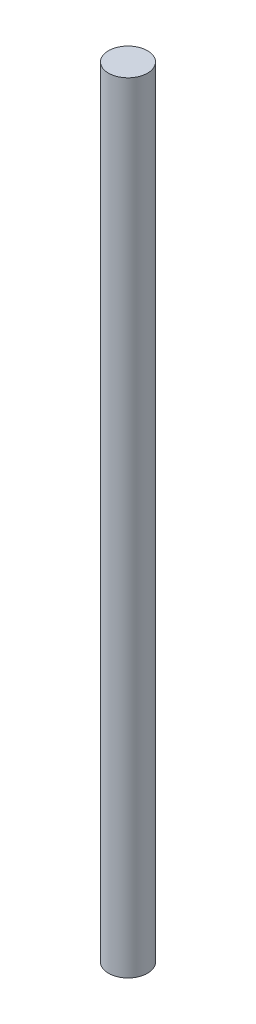
ISO-10303-21;
HEADER;
FILE_DESCRIPTION(('STEP AP214'),'2;1');
FILE_NAME('part.step','',(''),(''),'','','');
FILE_SCHEMA(('AUTOMOTIVE_DESIGN { 1 0 10303 214 1 1 1 1 }'));
ENDSEC;
DATA;
#1=APPLICATION_CONTEXT('core data for automotive mechanical design processes');
#2=APPLICATION_PROTOCOL_DEFINITION('international standard','automotive_design',2000,#1);
#3=PRODUCT_CONTEXT('',#1,'mechanical');
#4=PRODUCT('Part','Part','',(#3));
#5=PRODUCT_RELATED_PRODUCT_CATEGORY('part','',(#4));
#6=PRODUCT_DEFINITION_FORMATION('','',#4);
#7=PRODUCT_DEFINITION_CONTEXT('part definition',#1,'design');
#8=PRODUCT_DEFINITION('design','',#6,#7);
#9=PRODUCT_DEFINITION_SHAPE('','',#8);
#10=(LENGTH_UNIT() NAMED_UNIT(*) SI_UNIT(.MILLI.,.METRE.));
#11=(NAMED_UNIT(*) PLANE_ANGLE_UNIT() SI_UNIT($,.RADIAN.));
#12=(NAMED_UNIT(*) SI_UNIT($,.STERADIAN.) SOLID_ANGLE_UNIT());
#13=UNCERTAINTY_MEASURE_WITH_UNIT(LENGTH_MEASURE(1.E-05),#10,'distance_accuracy_value','');
#14=(GEOMETRIC_REPRESENTATION_CONTEXT(3) GLOBAL_UNCERTAINTY_ASSIGNED_CONTEXT((#13)) GLOBAL_UNIT_ASSIGNED_CONTEXT((#10,
#11,#12)) REPRESENTATION_CONTEXT('',''));
#15=CARTESIAN_POINT('',(0.,0.,0.));
#16=DIRECTION('',(0.,0.,1.));
#17=DIRECTION('',(1.,0.,0.));
#18=AXIS2_PLACEMENT_3D('',#15,#16,#17);
#19=CARTESIAN_POINT('',(0.,100.,0.));
#20=DIRECTION('',(0.,-1.,0.));
#21=DIRECTION('',(0.,0.,-1.));
#22=AXIS2_PLACEMENT_3D('',#19,#20,#21);
#23=CYLINDRICAL_SURFACE('',#22,2.5);
#24=CARTESIAN_POINT('',(0.,100.,0.));
#25=DIRECTION('',(0.,1.,0.));
#26=DIRECTION('',(0.,0.,1.));
#27=AXIS2_PLACEMENT_3D('',#24,#25,#26);
#28=CIRCLE('',#27,2.5);
#29=CARTESIAN_POINT('',(0.,100.,2.5));
#30=VERTEX_POINT('',#29);
#31=EDGE_CURVE('E10',#30,#30,#28,.T.);
#32=ORIENTED_EDGE('',*,*,#31,.F.);
#33=EDGE_LOOP('',(#32));
#34=FACE_BOUND('',#33,.T.);
#35=CARTESIAN_POINT('',(0.,0.,0.));
#36=DIRECTION('',(0.,1.,0.));
#37=DIRECTION('',(0.,0.,1.));
#38=AXIS2_PLACEMENT_3D('',#35,#36,#37);
#39=CIRCLE('',#38,2.5);
#40=CARTESIAN_POINT('',(0.,0.,2.5));
#41=VERTEX_POINT('',#40);
#42=EDGE_CURVE('E46',#41,#41,#39,.T.);
#43=ORIENTED_EDGE('',*,*,#42,.T.);
#44=EDGE_LOOP('',(#43));
#45=FACE_BOUND('',#44,.T.);
#46=ADVANCED_FACE('F43',(#34,#45),#23,.T.);
#47=CARTESIAN_POINT('',(0.,100.,0.));
#48=DIRECTION('',(0.,1.,0.));
#49=DIRECTION('',(0.,0.,1.));
#50=AXIS2_PLACEMENT_3D('',#47,#48,#49);
#51=PLANE('',#50);
#52=ORIENTED_EDGE('',*,*,#31,.T.);
#53=EDGE_LOOP('',(#52));
#54=FACE_BOUND('',#53,.T.);
#55=ADVANCED_FACE('F60',(#54),#51,.T.);
#56=CARTESIAN_POINT('',(0.,0.,0.));
#57=DIRECTION('',(0.,1.,0.));
#58=DIRECTION('',(0.,0.,1.));
#59=AXIS2_PLACEMENT_3D('',#56,#57,#58);
#60=PLANE('',#59);
#61=ORIENTED_EDGE('',*,*,#42,.F.);
#62=EDGE_LOOP('',(#61));
#63=FACE_BOUND('',#62,.T.);
#64=ADVANCED_FACE('F58',(#63),#60,.F.);
#65=CLOSED_SHELL('',(#46,#55,#64));
#66=MANIFOLD_SOLID_BREP('B2',#65);
#67=ADVANCED_BREP_SHAPE_REPRESENTATION('',(#18,#66),#14);
#68=SHAPE_DEFINITION_REPRESENTATION(#9,#67);
ENDSEC;
END-ISO-10303-21;
